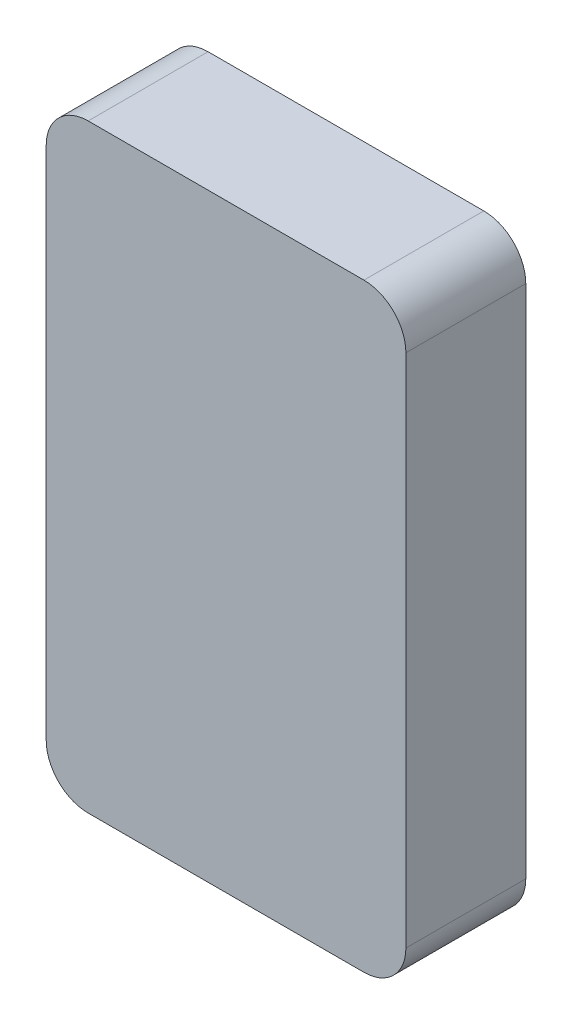
ISO-10303-21;
HEADER;
FILE_DESCRIPTION(('STEP AP214'),'2;1');
FILE_NAME('part.step','',(''),(''),'','','');
FILE_SCHEMA(('AUTOMOTIVE_DESIGN { 1 0 10303 214 1 1 1 1 }'));
ENDSEC;
DATA;
#1=APPLICATION_CONTEXT('core data for automotive mechanical design processes');
#2=APPLICATION_PROTOCOL_DEFINITION('international standard','automotive_design',2000,#1);
#3=PRODUCT_CONTEXT('',#1,'mechanical');
#4=PRODUCT('Part','Part','',(#3));
#5=PRODUCT_RELATED_PRODUCT_CATEGORY('part','',(#4));
#6=PRODUCT_DEFINITION_FORMATION('','',#4);
#7=PRODUCT_DEFINITION_CONTEXT('part definition',#1,'design');
#8=PRODUCT_DEFINITION('design','',#6,#7);
#9=PRODUCT_DEFINITION_SHAPE('','',#8);
#10=(LENGTH_UNIT() NAMED_UNIT(*) SI_UNIT(.MILLI.,.METRE.));
#11=(NAMED_UNIT(*) PLANE_ANGLE_UNIT() SI_UNIT($,.RADIAN.));
#12=(NAMED_UNIT(*) SI_UNIT($,.STERADIAN.) SOLID_ANGLE_UNIT());
#13=UNCERTAINTY_MEASURE_WITH_UNIT(LENGTH_MEASURE(1.E-05),#10,'distance_accuracy_value','');
#14=(GEOMETRIC_REPRESENTATION_CONTEXT(3) GLOBAL_UNCERTAINTY_ASSIGNED_CONTEXT((#13)) GLOBAL_UNIT_ASSIGNED_CONTEXT((#10,
#11,#12)) REPRESENTATION_CONTEXT('',''));
#15=CARTESIAN_POINT('',(0.,0.,0.));
#16=DIRECTION('',(0.,0.,1.));
#17=DIRECTION('',(1.,0.,0.));
#18=AXIS2_PLACEMENT_3D('',#15,#16,#17);
#19=CARTESIAN_POINT('',(150.,-250.,-100.));
#20=DIRECTION('',(1.,0.,0.));
#21=DIRECTION('',(0.,0.,-1.));
#22=AXIS2_PLACEMENT_3D('',#19,#20,#21);
#23=PLANE('',#22);
#24=DIRECTION('',(0.,1.,0.));
#25=VECTOR('',#24,1.);
#26=CARTESIAN_POINT('',(150.,-250.,0.));
#27=LINE('',#26,#25);
#28=CARTESIAN_POINT('',(150.,-215.,0.));
#29=VERTEX_POINT('',#28);
#30=CARTESIAN_POINT('',(150.,215.,0.));
#31=VERTEX_POINT('',#30);
#32=EDGE_CURVE('E157',#29,#31,#27,.T.);
#33=ORIENTED_EDGE('',*,*,#32,.F.);
#34=DIRECTION('',(0.,0.,1.));
#35=VECTOR('',#34,1.);
#36=CARTESIAN_POINT('',(150.,-215.,-100.));
#37=LINE('',#36,#35);
#38=CARTESIAN_POINT('',(150.,-215.,-100.));
#39=VERTEX_POINT('',#38);
#40=EDGE_CURVE('E138',#29,#39,#37,.F.);
#41=ORIENTED_EDGE('',*,*,#40,.T.);
#42=DIRECTION('',(0.,1.,0.));
#43=VECTOR('',#42,1.);
#44=CARTESIAN_POINT('',(150.,-250.,-100.));
#45=LINE('',#44,#43);
#46=CARTESIAN_POINT('',(150.,215.,-100.));
#47=VERTEX_POINT('',#46);
#48=EDGE_CURVE('E119',#39,#47,#45,.T.);
#49=ORIENTED_EDGE('',*,*,#48,.T.);
#50=DIRECTION('',(0.,0.,1.));
#51=VECTOR('',#50,1.);
#52=CARTESIAN_POINT('',(150.,215.,-100.));
#53=LINE('',#52,#51);
#54=EDGE_CURVE('E135',#47,#31,#53,.T.);
#55=ORIENTED_EDGE('',*,*,#54,.T.);
#56=EDGE_LOOP('',(#33,#41,#49,#55));
#57=FACE_BOUND('',#56,.T.);
#58=ADVANCED_FACE('F33',(#57),#23,.T.);
#59=CARTESIAN_POINT('',(-150.,-250.,-100.));
#60=DIRECTION('',(0.,-1.,0.));
#61=DIRECTION('',(0.,0.,-1.));
#62=AXIS2_PLACEMENT_3D('',#59,#60,#61);
#63=PLANE('',#62);
#64=DIRECTION('',(1.,0.,0.));
#65=VECTOR('',#64,1.);
#66=CARTESIAN_POINT('',(-150.,-250.,-100.));
#67=LINE('',#66,#65);
#68=CARTESIAN_POINT('',(-115.,-250.,-100.));
#69=VERTEX_POINT('',#68);
#70=CARTESIAN_POINT('',(115.,-250.,-100.));
#71=VERTEX_POINT('',#70);
#72=EDGE_CURVE('E124',#69,#71,#67,.T.);
#73=ORIENTED_EDGE('',*,*,#72,.T.);
#74=DIRECTION('',(0.,0.,1.));
#75=VECTOR('',#74,1.);
#76=CARTESIAN_POINT('',(115.,-250.,-100.));
#77=LINE('',#76,#75);
#78=CARTESIAN_POINT('',(115.,-250.,0.));
#79=VERTEX_POINT('',#78);
#80=EDGE_CURVE('E118',#71,#79,#77,.T.);
#81=ORIENTED_EDGE('',*,*,#80,.T.);
#82=DIRECTION('',(1.,0.,0.));
#83=VECTOR('',#82,1.);
#84=CARTESIAN_POINT('',(-150.,-250.,0.));
#85=LINE('',#84,#83);
#86=CARTESIAN_POINT('',(-115.,-250.,0.));
#87=VERTEX_POINT('',#86);
#88=EDGE_CURVE('E101',#87,#79,#85,.T.);
#89=ORIENTED_EDGE('',*,*,#88,.F.);
#90=DIRECTION('',(0.,0.,1.));
#91=VECTOR('',#90,1.);
#92=CARTESIAN_POINT('',(-115.,-250.,-100.));
#93=LINE('',#92,#91);
#94=EDGE_CURVE('E115',#87,#69,#93,.F.);
#95=ORIENTED_EDGE('',*,*,#94,.T.);
#96=EDGE_LOOP('',(#73,#81,#89,#95));
#97=FACE_BOUND('',#96,.T.);
#98=ADVANCED_FACE('F114',(#97),#63,.T.);
#99=CARTESIAN_POINT('',(-150.,-250.,-100.));
#100=DIRECTION('',(-1.,0.,0.));
#101=DIRECTION('',(0.,0.,1.));
#102=AXIS2_PLACEMENT_3D('',#99,#100,#101);
#103=PLANE('',#102);
#104=DIRECTION('',(0.,-1.,0.));
#105=VECTOR('',#104,1.);
#106=CARTESIAN_POINT('',(-150.,-250.,-100.));
#107=LINE('',#106,#105);
#108=CARTESIAN_POINT('',(-150.,215.,-100.));
#109=VERTEX_POINT('',#108);
#110=CARTESIAN_POINT('',(-150.,-215.,-100.));
#111=VERTEX_POINT('',#110);
#112=EDGE_CURVE('E128',#109,#111,#107,.T.);
#113=ORIENTED_EDGE('',*,*,#112,.T.);
#114=DIRECTION('',(0.,0.,1.));
#115=VECTOR('',#114,1.);
#116=CARTESIAN_POINT('',(-150.,-215.,-100.));
#117=LINE('',#116,#115);
#118=CARTESIAN_POINT('',(-150.,-215.,0.));
#119=VERTEX_POINT('',#118);
#120=EDGE_CURVE('E148',#111,#119,#117,.T.);
#121=ORIENTED_EDGE('',*,*,#120,.T.);
#122=DIRECTION('',(0.,-1.,0.));
#123=VECTOR('',#122,1.);
#124=CARTESIAN_POINT('',(-150.,-250.,0.));
#125=LINE('',#124,#123);
#126=CARTESIAN_POINT('',(-150.,215.,0.));
#127=VERTEX_POINT('',#126);
#128=EDGE_CURVE('E103',#127,#119,#125,.T.);
#129=ORIENTED_EDGE('',*,*,#128,.F.);
#130=DIRECTION('',(0.,0.,1.));
#131=VECTOR('',#130,1.);
#132=CARTESIAN_POINT('',(-150.,215.,-100.));
#133=LINE('',#132,#131);
#134=EDGE_CURVE('E146',#127,#109,#133,.F.);
#135=ORIENTED_EDGE('',*,*,#134,.T.);
#136=EDGE_LOOP('',(#113,#121,#129,#135));
#137=FACE_BOUND('',#136,.T.);
#138=ADVANCED_FACE('F183',(#137),#103,.T.);
#139=CARTESIAN_POINT('',(-150.,250.,-100.));
#140=DIRECTION('',(0.,1.,0.));
#141=DIRECTION('',(0.,0.,1.));
#142=AXIS2_PLACEMENT_3D('',#139,#140,#141);
#143=PLANE('',#142);
#144=DIRECTION('',(-1.,0.,0.));
#145=VECTOR('',#144,1.);
#146=CARTESIAN_POINT('',(-150.,250.,0.));
#147=LINE('',#146,#145);
#148=CARTESIAN_POINT('',(115.,250.,0.));
#149=VERTEX_POINT('',#148);
#150=CARTESIAN_POINT('',(-115.,250.,0.));
#151=VERTEX_POINT('',#150);
#152=EDGE_CURVE('E153',#149,#151,#147,.T.);
#153=ORIENTED_EDGE('',*,*,#152,.F.);
#154=DIRECTION('',(0.,0.,1.));
#155=VECTOR('',#154,1.);
#156=CARTESIAN_POINT('',(115.,250.,-100.));
#157=LINE('',#156,#155);
#158=CARTESIAN_POINT('',(115.,250.,-100.));
#159=VERTEX_POINT('',#158);
#160=EDGE_CURVE('E11',#149,#159,#157,.F.);
#161=ORIENTED_EDGE('',*,*,#160,.T.);
#162=DIRECTION('',(-1.,0.,0.));
#163=VECTOR('',#162,1.);
#164=CARTESIAN_POINT('',(-150.,250.,-100.));
#165=LINE('',#164,#163);
#166=CARTESIAN_POINT('',(-115.,250.,-100.));
#167=VERTEX_POINT('',#166);
#168=EDGE_CURVE('E154',#159,#167,#165,.T.);
#169=ORIENTED_EDGE('',*,*,#168,.T.);
#170=DIRECTION('',(0.,0.,1.));
#171=VECTOR('',#170,1.);
#172=CARTESIAN_POINT('',(-115.,250.,-100.));
#173=LINE('',#172,#171);
#174=EDGE_CURVE('E41',#167,#151,#173,.T.);
#175=ORIENTED_EDGE('',*,*,#174,.T.);
#176=EDGE_LOOP('',(#153,#161,#169,#175));
#177=FACE_BOUND('',#176,.T.);
#178=ADVANCED_FACE('F152',(#177),#143,.T.);
#179=CARTESIAN_POINT('',(0.,0.,-100.));
#180=DIRECTION('',(0.,0.,-1.));
#181=DIRECTION('',(-1.,0.,0.));
#182=AXIS2_PLACEMENT_3D('',#179,#180,#181);
#183=PLANE('',#182);
#184=ORIENTED_EDGE('',*,*,#48,.F.);
#185=CARTESIAN_POINT('',(115.,-215.,-100.));
#186=DIRECTION('',(0.,0.,-1.));
#187=DIRECTION('',(-1.,0.,0.));
#188=AXIS2_PLACEMENT_3D('',#185,#186,#187);
#189=CIRCLE('',#188,35.);
#190=EDGE_CURVE('E144',#39,#71,#189,.T.);
#191=ORIENTED_EDGE('',*,*,#190,.T.);
#192=ORIENTED_EDGE('',*,*,#72,.F.);
#193=CARTESIAN_POINT('',(-115.,-215.,-100.));
#194=DIRECTION('',(0.,0.,-1.));
#195=DIRECTION('',(-1.,0.,0.));
#196=AXIS2_PLACEMENT_3D('',#193,#194,#195);
#197=CIRCLE('',#196,35.);
#198=EDGE_CURVE('E123',#69,#111,#197,.T.);
#199=ORIENTED_EDGE('',*,*,#198,.T.);
#200=ORIENTED_EDGE('',*,*,#112,.F.);
#201=CARTESIAN_POINT('',(-115.,215.,-100.));
#202=DIRECTION('',(0.,0.,-1.));
#203=DIRECTION('',(-1.,0.,0.));
#204=AXIS2_PLACEMENT_3D('',#201,#202,#203);
#205=CIRCLE('',#204,35.);
#206=EDGE_CURVE('E48',#109,#167,#205,.T.);
#207=ORIENTED_EDGE('',*,*,#206,.T.);
#208=ORIENTED_EDGE('',*,*,#168,.F.);
#209=CARTESIAN_POINT('',(115.,215.,-100.));
#210=DIRECTION('',(0.,0.,-1.));
#211=DIRECTION('',(-1.,0.,0.));
#212=AXIS2_PLACEMENT_3D('',#209,#210,#211);
#213=CIRCLE('',#212,35.);
#214=EDGE_CURVE('E141',#159,#47,#213,.T.);
#215=ORIENTED_EDGE('',*,*,#214,.T.);
#216=EDGE_LOOP('',(#184,#191,#192,#199,#200,#207,#208,#215));
#217=FACE_BOUND('',#216,.T.);
#218=ADVANCED_FACE('F174',(#217),#183,.T.);
#219=CARTESIAN_POINT('',(0.,0.,0.));
#220=DIRECTION('',(0.,0.,-1.));
#221=DIRECTION('',(-1.,0.,0.));
#222=AXIS2_PLACEMENT_3D('',#219,#220,#221);
#223=PLANE('',#222);
#224=ORIENTED_EDGE('',*,*,#88,.T.);
#225=CARTESIAN_POINT('',(115.,-215.,0.));
#226=DIRECTION('',(0.,0.,-1.));
#227=DIRECTION('',(-1.,0.,0.));
#228=AXIS2_PLACEMENT_3D('',#225,#226,#227);
#229=CIRCLE('',#228,35.);
#230=EDGE_CURVE('E108',#79,#29,#229,.F.);
#231=ORIENTED_EDGE('',*,*,#230,.T.);
#232=ORIENTED_EDGE('',*,*,#32,.T.);
#233=CARTESIAN_POINT('',(115.,215.,0.));
#234=DIRECTION('',(0.,0.,-1.));
#235=DIRECTION('',(-1.,0.,0.));
#236=AXIS2_PLACEMENT_3D('',#233,#234,#235);
#237=CIRCLE('',#236,35.);
#238=EDGE_CURVE('E109',#31,#149,#237,.F.);
#239=ORIENTED_EDGE('',*,*,#238,.T.);
#240=ORIENTED_EDGE('',*,*,#152,.T.);
#241=CARTESIAN_POINT('',(-115.,215.,0.));
#242=DIRECTION('',(0.,0.,-1.));
#243=DIRECTION('',(-1.,0.,0.));
#244=AXIS2_PLACEMENT_3D('',#241,#242,#243);
#245=CIRCLE('',#244,35.);
#246=EDGE_CURVE('E126',#151,#127,#245,.F.);
#247=ORIENTED_EDGE('',*,*,#246,.T.);
#248=ORIENTED_EDGE('',*,*,#128,.T.);
#249=CARTESIAN_POINT('',(-115.,-215.,0.));
#250=DIRECTION('',(0.,0.,-1.));
#251=DIRECTION('',(-1.,0.,0.));
#252=AXIS2_PLACEMENT_3D('',#249,#250,#251);
#253=CIRCLE('',#252,35.);
#254=EDGE_CURVE('E98',#119,#87,#253,.F.);
#255=ORIENTED_EDGE('',*,*,#254,.T.);
#256=EDGE_LOOP('',(#224,#231,#232,#239,#240,#247,#248,#255));
#257=FACE_BOUND('',#256,.T.);
#258=ADVANCED_FACE('F100',(#257),#223,.F.);
#259=CARTESIAN_POINT('',(115.,-215.,-100.));
#260=DIRECTION('',(0.,0.,1.));
#261=DIRECTION('',(1.,0.,0.));
#262=AXIS2_PLACEMENT_3D('',#259,#260,#261);
#263=CYLINDRICAL_SURFACE('',#262,35.);
#264=ORIENTED_EDGE('',*,*,#190,.F.);
#265=ORIENTED_EDGE('',*,*,#40,.F.);
#266=ORIENTED_EDGE('',*,*,#230,.F.);
#267=ORIENTED_EDGE('',*,*,#80,.F.);
#268=EDGE_LOOP('',(#264,#265,#266,#267));
#269=FACE_BOUND('',#268,.T.);
#270=ADVANCED_FACE('F181',(#269),#263,.T.);
#271=CARTESIAN_POINT('',(-115.,-215.,-100.));
#272=DIRECTION('',(0.,0.,1.));
#273=DIRECTION('',(1.,0.,0.));
#274=AXIS2_PLACEMENT_3D('',#271,#272,#273);
#275=CYLINDRICAL_SURFACE('',#274,35.);
#276=ORIENTED_EDGE('',*,*,#198,.F.);
#277=ORIENTED_EDGE('',*,*,#94,.F.);
#278=ORIENTED_EDGE('',*,*,#254,.F.);
#279=ORIENTED_EDGE('',*,*,#120,.F.);
#280=EDGE_LOOP('',(#276,#277,#278,#279));
#281=FACE_BOUND('',#280,.T.);
#282=ADVANCED_FACE('F122',(#281),#275,.T.);
#283=CARTESIAN_POINT('',(115.,215.,-100.));
#284=DIRECTION('',(0.,0.,1.));
#285=DIRECTION('',(1.,0.,0.));
#286=AXIS2_PLACEMENT_3D('',#283,#284,#285);
#287=CYLINDRICAL_SURFACE('',#286,35.);
#288=ORIENTED_EDGE('',*,*,#214,.F.);
#289=ORIENTED_EDGE('',*,*,#160,.F.);
#290=ORIENTED_EDGE('',*,*,#238,.F.);
#291=ORIENTED_EDGE('',*,*,#54,.F.);
#292=EDGE_LOOP('',(#288,#289,#290,#291));
#293=FACE_BOUND('',#292,.T.);
#294=ADVANCED_FACE('F173',(#293),#287,.T.);
#295=CARTESIAN_POINT('',(-115.,215.,-100.));
#296=DIRECTION('',(0.,0.,1.));
#297=DIRECTION('',(1.,0.,0.));
#298=AXIS2_PLACEMENT_3D('',#295,#296,#297);
#299=CYLINDRICAL_SURFACE('',#298,35.);
#300=ORIENTED_EDGE('',*,*,#206,.F.);
#301=ORIENTED_EDGE('',*,*,#134,.F.);
#302=ORIENTED_EDGE('',*,*,#246,.F.);
#303=ORIENTED_EDGE('',*,*,#174,.F.);
#304=EDGE_LOOP('',(#300,#301,#302,#303));
#305=FACE_BOUND('',#304,.T.);
#306=ADVANCED_FACE('F35',(#305),#299,.T.);
#307=CLOSED_SHELL('',(#58,#98,#138,#178,#218,#258,#270,#282,#294,#306));
#308=MANIFOLD_SOLID_BREP('B2',#307);
#309=ADVANCED_BREP_SHAPE_REPRESENTATION('',(#18,#308),#14);
#310=SHAPE_DEFINITION_REPRESENTATION(#9,#309);
ENDSEC;
END-ISO-10303-21;
